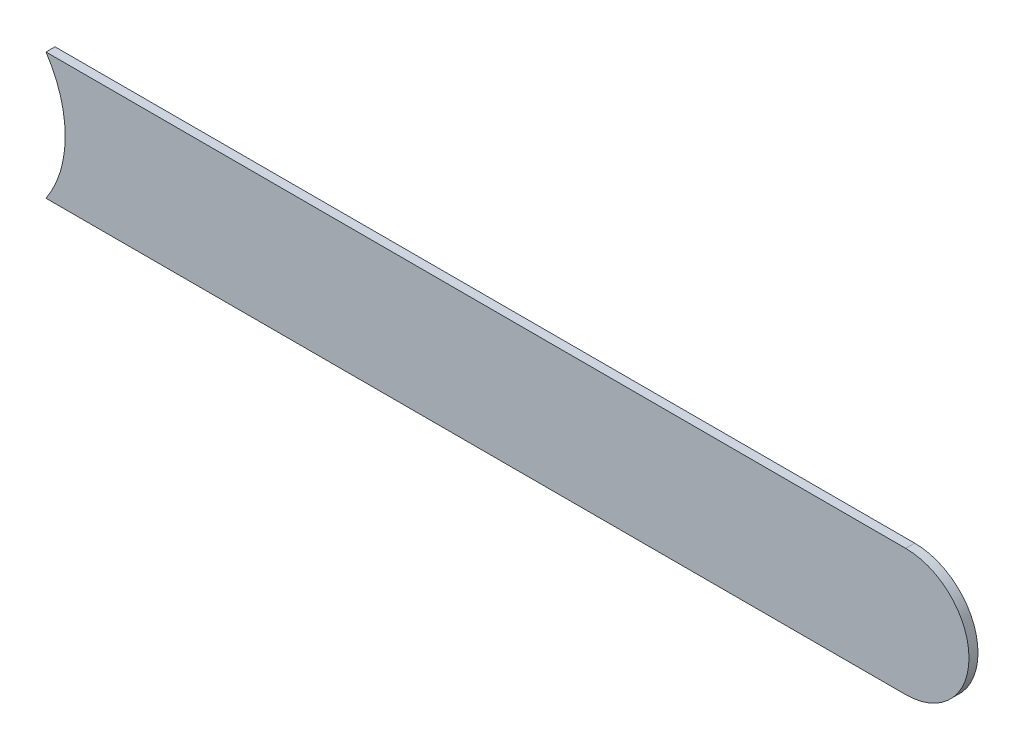
ISO-10303-21;
HEADER;
FILE_DESCRIPTION(('STEP AP214'),'2;1');
FILE_NAME('part.step','',(''),(''),'','','');
FILE_SCHEMA(('AUTOMOTIVE_DESIGN { 1 0 10303 214 1 1 1 1 }'));
ENDSEC;
DATA;
#1=APPLICATION_CONTEXT('core data for automotive mechanical design processes');
#2=APPLICATION_PROTOCOL_DEFINITION('international standard','automotive_design',2000,#1);
#3=PRODUCT_CONTEXT('',#1,'mechanical');
#4=PRODUCT('Part','Part','',(#3));
#5=PRODUCT_RELATED_PRODUCT_CATEGORY('part','',(#4));
#6=PRODUCT_DEFINITION_FORMATION('','',#4);
#7=PRODUCT_DEFINITION_CONTEXT('part definition',#1,'design');
#8=PRODUCT_DEFINITION('design','',#6,#7);
#9=PRODUCT_DEFINITION_SHAPE('','',#8);
#10=(LENGTH_UNIT() NAMED_UNIT(*) SI_UNIT(.MILLI.,.METRE.));
#11=(NAMED_UNIT(*) PLANE_ANGLE_UNIT() SI_UNIT($,.RADIAN.));
#12=(NAMED_UNIT(*) SI_UNIT($,.STERADIAN.) SOLID_ANGLE_UNIT());
#13=UNCERTAINTY_MEASURE_WITH_UNIT(LENGTH_MEASURE(1.E-05),#10,'distance_accuracy_value','');
#14=(GEOMETRIC_REPRESENTATION_CONTEXT(3) GLOBAL_UNCERTAINTY_ASSIGNED_CONTEXT((#13)) GLOBAL_UNIT_ASSIGNED_CONTEXT((#10,
#11,#12)) REPRESENTATION_CONTEXT('',''));
#15=CARTESIAN_POINT('',(0.,0.,0.));
#16=DIRECTION('',(0.,0.,1.));
#17=DIRECTION('',(1.,0.,0.));
#18=AXIS2_PLACEMENT_3D('',#15,#16,#17);
#19=CARTESIAN_POINT('',(36.2311925903459,73.2900109,0.));
#20=DIRECTION('',(0.,1.,0.));
#21=DIRECTION('',(1.,0.,0.));
#22=AXIS2_PLACEMENT_3D('',#19,#20,#21);
#23=PLANE('',#22);
#24=DIRECTION('',(1.,0.,0.));
#25=VECTOR('',#24,1.);
#26=CARTESIAN_POINT('',(35.8570276,73.2900109,0.03556));
#27=LINE('',#26,#25);
#28=CARTESIAN_POINT('',(36.2311925903459,73.2900109,0.03556));
#29=VERTEX_POINT('',#28);
#30=CARTESIAN_POINT('',(39.624,73.2900109,0.03556));
#31=VERTEX_POINT('',#30);
#32=EDGE_CURVE('E11',#29,#31,#27,.T.);
#33=ORIENTED_EDGE('',*,*,#32,.F.);
#34=DIRECTION('',(0.,0.,1.));
#35=VECTOR('',#34,1.);
#36=CARTESIAN_POINT('',(36.2311925903459,73.2900109,0.));
#37=LINE('',#36,#35);
#38=CARTESIAN_POINT('',(36.2311925903459,73.2900109,0.));
#39=VERTEX_POINT('',#38);
#40=EDGE_CURVE('E24',#39,#29,#37,.T.);
#41=ORIENTED_EDGE('',*,*,#40,.F.);
#42=DIRECTION('',(1.,0.,0.));
#43=VECTOR('',#42,1.);
#44=CARTESIAN_POINT('',(35.8570276,73.2900109,0.));
#45=LINE('',#44,#43);
#46=CARTESIAN_POINT('',(39.624,73.2900109,0.));
#47=VERTEX_POINT('',#46);
#48=EDGE_CURVE('E82',#39,#47,#45,.T.);
#49=ORIENTED_EDGE('',*,*,#48,.T.);
#50=DIRECTION('',(0.,0.,1.));
#51=VECTOR('',#50,1.);
#52=CARTESIAN_POINT('',(39.624,73.2900109,0.));
#53=LINE('',#52,#51);
#54=EDGE_CURVE('E37',#47,#31,#53,.T.);
#55=ORIENTED_EDGE('',*,*,#54,.T.);
#56=EDGE_LOOP('',(#33,#41,#49,#55));
#57=FACE_BOUND('',#56,.T.);
#58=ADVANCED_FACE('F17',(#57),#23,.F.);
#59=CARTESIAN_POINT('',(39.624,73.5400104,0.));
#60=DIRECTION('',(0.,0.,-1.));
#61=DIRECTION('',(0.,-1.,0.));
#62=AXIS2_PLACEMENT_3D('',#59,#60,#61);
#63=CYLINDRICAL_SURFACE('',#62,0.249999499999997);
#64=CARTESIAN_POINT('',(39.624,73.5400104,0.03556));
#65=DIRECTION('',(0.,0.,1.));
#66=DIRECTION('',(0.,-1.,0.));
#67=AXIS2_PLACEMENT_3D('',#64,#65,#66);
#68=CIRCLE('',#67,0.249999499999997);
#69=CARTESIAN_POINT('',(39.624,73.7900099,0.03556));
#70=VERTEX_POINT('',#69);
#71=EDGE_CURVE('E97',#31,#70,#68,.T.);
#72=ORIENTED_EDGE('',*,*,#71,.F.);
#73=ORIENTED_EDGE('',*,*,#54,.F.);
#74=CARTESIAN_POINT('',(39.624,73.5400104,0.));
#75=DIRECTION('',(0.,0.,1.));
#76=DIRECTION('',(0.,-1.,0.));
#77=AXIS2_PLACEMENT_3D('',#74,#75,#76);
#78=CIRCLE('',#77,0.249999499999997);
#79=CARTESIAN_POINT('',(39.624,73.7900099,0.));
#80=VERTEX_POINT('',#79);
#81=EDGE_CURVE('E94',#47,#80,#78,.T.);
#82=ORIENTED_EDGE('',*,*,#81,.T.);
#83=DIRECTION('',(0.,0.,1.));
#84=VECTOR('',#83,1.);
#85=CARTESIAN_POINT('',(39.624,73.7900099,0.));
#86=LINE('',#85,#84);
#87=EDGE_CURVE('E92',#80,#70,#86,.T.);
#88=ORIENTED_EDGE('',*,*,#87,.T.);
#89=EDGE_LOOP('',(#72,#73,#82,#88));
#90=FACE_BOUND('',#89,.T.);
#91=ADVANCED_FACE('F103',(#90),#63,.T.);
#92=CARTESIAN_POINT('',(39.624,73.7900099,0.));
#93=DIRECTION('',(0.,-1.,0.));
#94=DIRECTION('',(-1.,0.,0.));
#95=AXIS2_PLACEMENT_3D('',#92,#93,#94);
#96=PLANE('',#95);
#97=DIRECTION('',(-1.,0.,0.));
#98=VECTOR('',#97,1.);
#99=CARTESIAN_POINT('',(39.624,73.7900099,0.03556));
#100=LINE('',#99,#98);
#101=CARTESIAN_POINT('',(36.2311925903459,73.7900099,0.03556));
#102=VERTEX_POINT('',#101);
#103=EDGE_CURVE('E89',#70,#102,#100,.T.);
#104=ORIENTED_EDGE('',*,*,#103,.F.);
#105=ORIENTED_EDGE('',*,*,#87,.F.);
#106=DIRECTION('',(-1.,0.,0.));
#107=VECTOR('',#106,1.);
#108=CARTESIAN_POINT('',(39.624,73.7900099,0.));
#109=LINE('',#108,#107);
#110=CARTESIAN_POINT('',(36.2311925903459,73.7900099,0.));
#111=VERTEX_POINT('',#110);
#112=EDGE_CURVE('E87',#80,#111,#109,.T.);
#113=ORIENTED_EDGE('',*,*,#112,.T.);
#114=DIRECTION('',(0.,0.,1.));
#115=VECTOR('',#114,1.);
#116=CARTESIAN_POINT('',(36.2311925903459,73.7900099,0.));
#117=LINE('',#116,#115);
#118=EDGE_CURVE('E69',#111,#102,#117,.T.);
#119=ORIENTED_EDGE('',*,*,#118,.T.);
#120=EDGE_LOOP('',(#104,#105,#113,#119));
#121=FACE_BOUND('',#120,.T.);
#122=ADVANCED_FACE('F108',(#121),#96,.F.);
#123=CARTESIAN_POINT('',(35.8570276,73.5400104,0.));
#124=DIRECTION('',(0.,0.,-1.));
#125=DIRECTION('',(1.,0.,0.));
#126=AXIS2_PLACEMENT_3D('',#123,#124,#125);
#127=CYLINDRICAL_SURFACE('',#126,0.4499991);
#128=DIRECTION('',(0.,0.,1.));
#129=VECTOR('',#128,1.);
#130=CARTESIAN_POINT('',(36.3070267,73.5400104,0.));
#131=LINE('',#130,#129);
#132=CARTESIAN_POINT('',(36.3070267,73.5400104,0.));
#133=VERTEX_POINT('',#132);
#134=CARTESIAN_POINT('',(36.3070267,73.5400104,0.03556));
#135=VERTEX_POINT('',#134);
#136=EDGE_CURVE('E59',#133,#135,#131,.T.);
#137=ORIENTED_EDGE('',*,*,#136,.T.);
#138=CARTESIAN_POINT('',(35.8570276,73.5400104,0.03556));
#139=DIRECTION('',(0.,0.,1.));
#140=DIRECTION('',(1.,0.,0.));
#141=AXIS2_PLACEMENT_3D('',#138,#139,#140);
#142=CIRCLE('',#141,0.4499991);
#143=EDGE_CURVE('E70',#135,#102,#142,.T.);
#144=ORIENTED_EDGE('',*,*,#143,.T.);
#145=ORIENTED_EDGE('',*,*,#118,.F.);
#146=CARTESIAN_POINT('',(35.8570276,73.5400104,0.));
#147=DIRECTION('',(0.,0.,1.));
#148=DIRECTION('',(1.,0.,0.));
#149=AXIS2_PLACEMENT_3D('',#146,#147,#148);
#150=CIRCLE('',#149,0.4499991);
#151=EDGE_CURVE('E73',#133,#111,#150,.T.);
#152=ORIENTED_EDGE('',*,*,#151,.F.);
#153=EDGE_LOOP('',(#137,#144,#145,#152));
#154=FACE_BOUND('',#153,.T.);
#155=ADVANCED_FACE('F74',(#154),#127,.F.);
#156=CARTESIAN_POINT('',(35.8570276,73.5400104,0.));
#157=DIRECTION('',(0.,0.,-1.));
#158=DIRECTION('',(1.,0.,0.));
#159=AXIS2_PLACEMENT_3D('',#156,#157,#158);
#160=CYLINDRICAL_SURFACE('',#159,0.4499991);
#161=ORIENTED_EDGE('',*,*,#40,.T.);
#162=CARTESIAN_POINT('',(35.8570276,73.5400104,0.03556));
#163=DIRECTION('',(0.,0.,1.));
#164=DIRECTION('',(1.,0.,0.));
#165=AXIS2_PLACEMENT_3D('',#162,#163,#164);
#166=CIRCLE('',#165,0.4499991);
#167=EDGE_CURVE('E65',#29,#135,#166,.T.);
#168=ORIENTED_EDGE('',*,*,#167,.T.);
#169=ORIENTED_EDGE('',*,*,#136,.F.);
#170=EDGE_CURVE('E63',#39,#133,#150,.T.);
#171=ORIENTED_EDGE('',*,*,#170,.F.);
#172=EDGE_LOOP('',(#161,#168,#169,#171));
#173=FACE_BOUND('',#172,.T.);
#174=ADVANCED_FACE('F61',(#173),#160,.F.);
#175=CARTESIAN_POINT('',(35.8570276,73.2900109,0.));
#176=DIRECTION('',(0.,0.,-1.));
#177=DIRECTION('',(-1.,0.,0.));
#178=AXIS2_PLACEMENT_3D('',#175,#176,#177);
#179=PLANE('',#178);
#180=ORIENTED_EDGE('',*,*,#48,.F.);
#181=ORIENTED_EDGE('',*,*,#170,.T.);
#182=ORIENTED_EDGE('',*,*,#151,.T.);
#183=ORIENTED_EDGE('',*,*,#112,.F.);
#184=ORIENTED_EDGE('',*,*,#81,.F.);
#185=EDGE_LOOP('',(#180,#181,#182,#183,#184));
#186=FACE_BOUND('',#185,.T.);
#187=ADVANCED_FACE('F80',(#186),#179,.T.);
#188=CARTESIAN_POINT('',(35.8570276,73.2900109,0.03556));
#189=DIRECTION('',(0.,0.,-1.));
#190=DIRECTION('',(-1.,0.,0.));
#191=AXIS2_PLACEMENT_3D('',#188,#189,#190);
#192=PLANE('',#191);
#193=ORIENTED_EDGE('',*,*,#167,.F.);
#194=ORIENTED_EDGE('',*,*,#32,.T.);
#195=ORIENTED_EDGE('',*,*,#71,.T.);
#196=ORIENTED_EDGE('',*,*,#103,.T.);
#197=ORIENTED_EDGE('',*,*,#143,.F.);
#198=EDGE_LOOP('',(#193,#194,#195,#196,#197));
#199=FACE_BOUND('',#198,.T.);
#200=ADVANCED_FACE('F106',(#199),#192,.F.);
#201=CLOSED_SHELL('',(#58,#91,#122,#155,#174,#187,#200));
#202=MANIFOLD_SOLID_BREP('B1',#201);
#203=ADVANCED_BREP_SHAPE_REPRESENTATION('',(#18,#202),#14);
#204=SHAPE_DEFINITION_REPRESENTATION(#9,#203);
ENDSEC;
END-ISO-10303-21;
